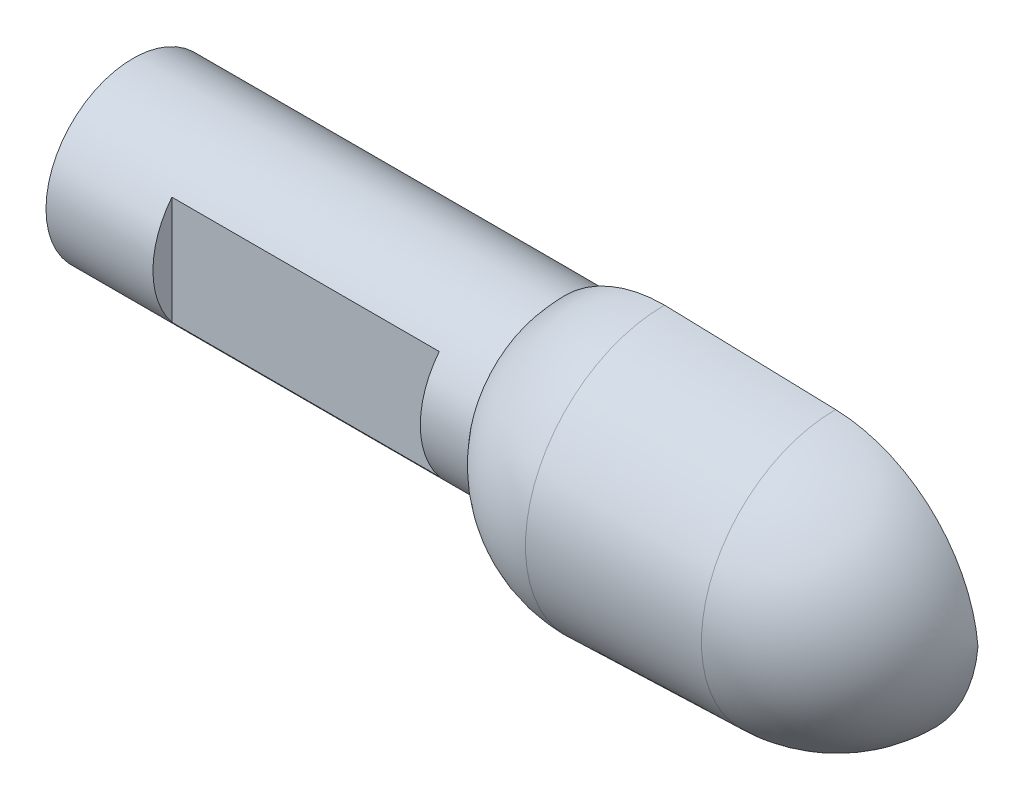
ISO-10303-21;
HEADER;
FILE_DESCRIPTION(('STEP AP214'),'2;1');
FILE_NAME('part.step','',(''),(''),'','','');
FILE_SCHEMA(('AUTOMOTIVE_DESIGN { 1 0 10303 214 1 1 1 1 }'));
ENDSEC;
DATA;
#1=APPLICATION_CONTEXT('core data for automotive mechanical design processes');
#2=APPLICATION_PROTOCOL_DEFINITION('international standard','automotive_design',2000,#1);
#3=PRODUCT_CONTEXT('',#1,'mechanical');
#4=PRODUCT('Part','Part','',(#3));
#5=PRODUCT_RELATED_PRODUCT_CATEGORY('part','',(#4));
#6=PRODUCT_DEFINITION_FORMATION('','',#4);
#7=PRODUCT_DEFINITION_CONTEXT('part definition',#1,'design');
#8=PRODUCT_DEFINITION('design','',#6,#7);
#9=PRODUCT_DEFINITION_SHAPE('','',#8);
#10=(LENGTH_UNIT() NAMED_UNIT(*) SI_UNIT(.MILLI.,.METRE.));
#11=(NAMED_UNIT(*) PLANE_ANGLE_UNIT() SI_UNIT($,.RADIAN.));
#12=(NAMED_UNIT(*) SI_UNIT($,.STERADIAN.) SOLID_ANGLE_UNIT());
#13=UNCERTAINTY_MEASURE_WITH_UNIT(LENGTH_MEASURE(1.E-05),#10,'distance_accuracy_value','');
#14=(GEOMETRIC_REPRESENTATION_CONTEXT(3) GLOBAL_UNCERTAINTY_ASSIGNED_CONTEXT((#13)) GLOBAL_UNIT_ASSIGNED_CONTEXT((#10,
#11,#12)) REPRESENTATION_CONTEXT('',''));
#15=CARTESIAN_POINT('',(0.,0.,0.));
#16=DIRECTION('',(0.,0.,1.));
#17=DIRECTION('',(1.,0.,0.));
#18=AXIS2_PLACEMENT_3D('',#15,#16,#17);
#19=CARTESIAN_POINT('',(-13.7943849702987,0.,0.));
#20=DIRECTION('',(-1.,0.,0.));
#21=DIRECTION('',(0.,0.,1.));
#22=AXIS2_PLACEMENT_3D('',#19,#20,#21);
#23=CYLINDRICAL_SURFACE('',#22,1.625);
#24=DIRECTION('',(1.,0.,0.));
#25=VECTOR('',#24,1.);
#26=CARTESIAN_POINT('',(-5.73150289017342,1.14456738278749,-1.15351224798828));
#27=LINE('',#26,#25);
#28=CARTESIAN_POINT('',(-5.73150289017342,1.14456738278749,-1.15351224798828));
#29=VERTEX_POINT('',#28);
#30=CARTESIAN_POINT('',(0.268497109826585,1.14456738278749,-1.15351224798828));
#31=VERTEX_POINT('',#30);
#32=EDGE_CURVE('E133',#29,#31,#27,.T.);
#33=ORIENTED_EDGE('',*,*,#32,.F.);
#34=CARTESIAN_POINT('',(-5.73150289017342,0.,2.59774840527527E-13));
#35=DIRECTION('',(1.,0.,0.));
#36=DIRECTION('',(0.,0.,1.));
#37=AXIS2_PLACEMENT_3D('',#34,#35,#36);
#38=CIRCLE('',#37,1.62500000000018);
#39=CARTESIAN_POINT('',(-5.73150289017342,-1.14456738278749,-1.15351224798828));
#40=VERTEX_POINT('',#39);
#41=EDGE_CURVE('E123',#40,#29,#38,.T.);
#42=ORIENTED_EDGE('',*,*,#41,.F.);
#43=DIRECTION('',(1.,0.,0.));
#44=VECTOR('',#43,1.);
#45=CARTESIAN_POINT('',(-5.73150289017342,-1.14456738278749,-1.15351224798828));
#46=LINE('',#45,#44);
#47=CARTESIAN_POINT('',(0.268497109826585,-1.14456738278749,-1.15351224798828));
#48=VERTEX_POINT('',#47);
#49=EDGE_CURVE('E135',#40,#48,#46,.T.);
#50=ORIENTED_EDGE('',*,*,#49,.T.);
#51=CARTESIAN_POINT('',(0.268497109826585,0.,2.59774840527527E-13));
#52=DIRECTION('',(1.,0.,0.));
#53=DIRECTION('',(0.,0.,1.));
#54=AXIS2_PLACEMENT_3D('',#51,#52,#53);
#55=CIRCLE('',#54,1.62500000000018);
#56=EDGE_CURVE('E138',#48,#31,#55,.T.);
#57=ORIENTED_EDGE('',*,*,#56,.T.);
#58=EDGE_LOOP('',(#33,#42,#50,#57));
#59=FACE_BOUND('',#58,.T.);
#60=DIRECTION('',(-1.,0.,0.));
#61=VECTOR('',#60,1.);
#62=CARTESIAN_POINT('',(0.368497109826584,1.01300672726204,1.27060708738848));
#63=LINE('',#62,#61);
#64=CARTESIAN_POINT('',(0.368497109826584,1.01300672726204,1.27060708738848));
#65=VERTEX_POINT('',#64);
#66=CARTESIAN_POINT('',(-4.63150289017342,1.01300672726204,1.27060708738848));
#67=VERTEX_POINT('',#66);
#68=EDGE_CURVE('E149',#65,#67,#63,.T.);
#69=ORIENTED_EDGE('',*,*,#68,.F.);
#70=CARTESIAN_POINT('',(0.368497109826584,0.,-2.29850860566927E-12));
#71=DIRECTION('',(-1.,0.,0.));
#72=DIRECTION('',(0.,0.,-1.));
#73=AXIS2_PLACEMENT_3D('',#70,#71,#72);
#74=CIRCLE('',#73,1.6250000000018);
#75=CARTESIAN_POINT('',(0.368497109826584,-1.01300672726204,1.27060708738848));
#76=VERTEX_POINT('',#75);
#77=EDGE_CURVE('E144',#76,#65,#74,.T.);
#78=ORIENTED_EDGE('',*,*,#77,.F.);
#79=DIRECTION('',(-1.,0.,0.));
#80=VECTOR('',#79,1.);
#81=CARTESIAN_POINT('',(0.368497109826584,-1.01300672726204,1.27060708738848));
#82=LINE('',#81,#80);
#83=CARTESIAN_POINT('',(-4.63150289017342,-1.01300672726204,1.27060708738848));
#84=VERTEX_POINT('',#83);
#85=EDGE_CURVE('E153',#76,#84,#82,.T.);
#86=ORIENTED_EDGE('',*,*,#85,.T.);
#87=CARTESIAN_POINT('',(-4.63150289017342,0.,-2.29850860566927E-12));
#88=DIRECTION('',(-1.,0.,0.));
#89=DIRECTION('',(0.,0.,-1.));
#90=AXIS2_PLACEMENT_3D('',#87,#88,#89);
#91=CIRCLE('',#90,1.6250000000018);
#92=EDGE_CURVE('E140',#84,#67,#91,.T.);
#93=ORIENTED_EDGE('',*,*,#92,.T.);
#94=EDGE_LOOP('',(#69,#78,#86,#93));
#95=FACE_BOUND('',#94,.T.);
#96=CARTESIAN_POINT('',(-6.63150289017342,0.,0.));
#97=DIRECTION('',(-1.,0.,0.));
#98=DIRECTION('',(0.,0.,1.));
#99=AXIS2_PLACEMENT_3D('',#96,#97,#98);
#100=CIRCLE('',#99,1.625);
#101=CARTESIAN_POINT('',(-6.63150289017342,0.,1.625));
#102=VERTEX_POINT('',#101);
#103=EDGE_CURVE('E252',#102,#102,#100,.T.);
#104=ORIENTED_EDGE('',*,*,#103,.F.);
#105=EDGE_LOOP('',(#104));
#106=FACE_BOUND('',#105,.T.);
#107=CARTESIAN_POINT('',(1.26849710982659,0.,0.));
#108=DIRECTION('',(1.,0.,0.));
#109=DIRECTION('',(0.,0.,-1.));
#110=AXIS2_PLACEMENT_3D('',#107,#108,#109);
#111=CIRCLE('',#110,1.625);
#112=CARTESIAN_POINT('',(1.26849710982658,-1.625,0.));
#113=VERTEX_POINT('',#112);
#114=CARTESIAN_POINT('',(1.26849710982658,1.625,0.));
#115=VERTEX_POINT('',#114);
#116=EDGE_CURVE('E229',#113,#115,#111,.T.);
#117=ORIENTED_EDGE('',*,*,#116,.F.);
#118=CARTESIAN_POINT('',(1.26849710982659,0.,0.));
#119=DIRECTION('',(-1.,0.,0.));
#120=DIRECTION('',(0.,0.,1.));
#121=AXIS2_PLACEMENT_3D('',#118,#119,#120);
#122=CIRCLE('',#121,1.625);
#123=EDGE_CURVE('E249',#113,#115,#122,.T.);
#124=ORIENTED_EDGE('',*,*,#123,.T.);
#125=EDGE_LOOP('',(#117,#124));
#126=FACE_BOUND('',#125,.T.);
#127=ADVANCED_FACE('F38',(#59,#95,#106,#126),#23,.T.);
#128=CARTESIAN_POINT('',(6.43158579270918,0.,-0.242385595637127));
#129=DIRECTION('',(0.,-1.,0.));
#130=DIRECTION('',(0.,0.,1.));
#131=AXIS2_PLACEMENT_3D('',#128,#129,#130);
#132=CIRCLE('',#131,2.75218391789528);
#133=TRIMMED_CURVE('',#132,(PARAMETER_VALUE(-1.48261180116489)),
(PARAMETER_VALUE(1.48261180116489)),.T.,.PARAMETER.);
#134=CARTESIAN_POINT('',(6.43158579270918,0.,0.));
#135=DIRECTION('',(-1.,0.,0.));
#136=AXIS1_PLACEMENT('',#134,#135);
#137=SURFACE_OF_REVOLUTION('',#133,#136);
#138=CARTESIAN_POINT('',(6.43158579270918,0.242385595637127,0.));
#139=DIRECTION('',(0.,0.,1.));
#140=DIRECTION('',(1.,0.,0.));
#141=AXIS2_PLACEMENT_3D('',#138,#139,#140);
#142=CIRCLE('',#141,2.75218391789528);
#143=CARTESIAN_POINT('',(6.51009574814901,-2.50867829035648,0.));
#144=VERTEX_POINT('',#143);
#145=CARTESIAN_POINT('',(9.17307544998477,0.,0.));
#146=VERTEX_POINT('',#145);
#147=EDGE_CURVE('E11',#144,#146,#142,.T.);
#148=ORIENTED_EDGE('',*,*,#147,.T.);
#149=CARTESIAN_POINT('',(6.43158579270918,-0.242385595637127,0.));
#150=DIRECTION('',(0.,0.,1.));
#151=DIRECTION('',(1.,0.,0.));
#152=AXIS2_PLACEMENT_3D('',#149,#150,#151);
#153=CIRCLE('',#152,2.75218391789528);
#154=CARTESIAN_POINT('',(6.51009574814901,2.50867829035648,0.));
#155=VERTEX_POINT('',#154);
#156=EDGE_CURVE('E46',#146,#155,#153,.T.);
#157=ORIENTED_EDGE('',*,*,#156,.T.);
#158=CARTESIAN_POINT('',(6.51009574814901,0.,0.));
#159=DIRECTION('',(-1.,0.,0.));
#160=DIRECTION('',(0.,0.,1.));
#161=AXIS2_PLACEMENT_3D('',#158,#159,#160);
#162=CIRCLE('',#161,2.50867829035648);
#163=EDGE_CURVE('E243',#144,#155,#162,.T.);
#164=ORIENTED_EDGE('',*,*,#163,.F.);
#165=EDGE_LOOP('',(#148,#157,#164));
#166=FACE_BOUND('',#165,.T.);
#167=ADVANCED_FACE('F258',(#166),#137,.T.);
#168=CARTESIAN_POINT('',(-6.63150289017342,0.,0.));
#169=DIRECTION('',(1.,0.,0.));
#170=DIRECTION('',(0.,0.,-1.));
#171=AXIS2_PLACEMENT_3D('',#168,#169,#170);
#172=PLANE('',#171);
#173=ORIENTED_EDGE('',*,*,#103,.T.);
#174=EDGE_LOOP('',(#173));
#175=FACE_BOUND('',#174,.T.);
#176=ADVANCED_FACE('F40',(#175),#172,.F.);
#177=CARTESIAN_POINT('',(3.31009574814917,0.,0.));
#178=DIRECTION('',(-1.,0.,0.));
#179=DIRECTION('',(0.,0.,1.));
#180=AXIS2_PLACEMENT_3D('',#177,#178,#179);
#181=DEGENERATE_TOROIDAL_SURFACE('',#180,0.0250000000003338,2.62500000000033,.F.);
#182=ORIENTED_EDGE('',*,*,#123,.F.);
#183=CARTESIAN_POINT('',(3.31009574814917,0.0250000000003338,0.));
#184=DIRECTION('',(0.,0.,1.));
#185=DIRECTION('',(1.,0.,0.));
#186=AXIS2_PLACEMENT_3D('',#183,#184,#185);
#187=CIRCLE('',#186,2.62500000000033);
#188=CARTESIAN_POINT('',(3.31009574814902,-2.6,0.));
#189=VERTEX_POINT('',#188);
#190=EDGE_CURVE('E240',#113,#189,#187,.T.);
#191=ORIENTED_EDGE('',*,*,#190,.T.);
#192=CARTESIAN_POINT('',(3.31009574814902,0.,0.));
#193=DIRECTION('',(-1.,0.,0.));
#194=DIRECTION('',(0.,0.,1.));
#195=AXIS2_PLACEMENT_3D('',#192,#193,#194);
#196=CIRCLE('',#195,2.6);
#197=CARTESIAN_POINT('',(3.31009574817045,2.59999999999969,0.));
#198=VERTEX_POINT('',#197);
#199=EDGE_CURVE('E246',#189,#198,#196,.T.);
#200=ORIENTED_EDGE('',*,*,#199,.T.);
#201=CARTESIAN_POINT('',(3.31009574814917,-0.0250000000003338,0.));
#202=DIRECTION('',(0.,0.,1.));
#203=DIRECTION('',(1.,0.,0.));
#204=AXIS2_PLACEMENT_3D('',#201,#202,#203);
#205=CIRCLE('',#204,2.62500000000033);
#206=EDGE_CURVE('E234',#198,#115,#205,.T.);
#207=ORIENTED_EDGE('',*,*,#206,.T.);
#208=EDGE_LOOP('',(#182,#191,#200,#207));
#209=FACE_BOUND('',#208,.T.);
#210=ADVANCED_FACE('F267',(#209),#181,.F.);
#211=CARTESIAN_POINT('',(6.51009574814901,0.,0.));
#212=DIRECTION('',(-1.,0.,0.));
#213=DIRECTION('',(0.,0.,1.));
#214=AXIS2_PLACEMENT_3D('',#211,#212,#213);
#215=CONICAL_SURFACE('',#214,2.50867829035648,0.0285302907375562);
#216=ORIENTED_EDGE('',*,*,#199,.F.);
#217=DIRECTION('',(0.999593038861106,0.0285264203926731,0.));
#218=VECTOR('',#217,1.);
#219=CARTESIAN_POINT('',(94.4165810787237,0.,0.));
#220=LINE('',#219,#218);
#221=EDGE_CURVE('E237',#189,#144,#220,.T.);
#222=ORIENTED_EDGE('',*,*,#221,.T.);
#223=ORIENTED_EDGE('',*,*,#163,.T.);
#224=DIRECTION('',(-0.999593038861106,0.0285264203926731,0.));
#225=VECTOR('',#224,1.);
#226=CARTESIAN_POINT('',(94.4165810787237,0.,0.));
#227=LINE('',#226,#225);
#228=EDGE_CURVE('E231',#155,#198,#227,.T.);
#229=ORIENTED_EDGE('',*,*,#228,.T.);
#230=EDGE_LOOP('',(#216,#222,#223,#229));
#231=FACE_BOUND('',#230,.T.);
#232=ADVANCED_FACE('F262',(#231),#215,.T.);
#233=CARTESIAN_POINT('',(9.17307544998477,-1.625,0.));
#234=DIRECTION('',(0.,0.,1.));
#235=DIRECTION('',(1.,0.,0.));
#236=AXIS2_PLACEMENT_3D('',#233,#234,#235);
#237=PLANE('',#236);
#238=DIRECTION('',(-1.,0.,0.));
#239=VECTOR('',#238,1.);
#240=CARTESIAN_POINT('',(6.7546160430892,-1.96286599297792,0.));
#241=LINE('',#240,#239);
#242=CARTESIAN_POINT('',(6.7546160430892,-1.96286599297792,0.));
#243=VERTEX_POINT('',#242);
#244=CARTESIAN_POINT('',(2.94362361413417,-1.96286599297792,0.));
#245=VERTEX_POINT('',#244);
#246=EDGE_CURVE('E159',#243,#245,#241,.T.);
#247=ORIENTED_EDGE('',*,*,#246,.F.);
#248=CARTESIAN_POINT('',(6.42445041489691,0.,0.));
#249=DIRECTION('',(0.,0.,-1.));
#250=DIRECTION('',(-1.,0.,0.));
#251=AXIS2_PLACEMENT_3D('',#248,#249,#250);
#252=CIRCLE('',#251,1.99044021473362);
#253=CARTESIAN_POINT('',(6.7546160430892,1.96286599297792,0.));
#254=VERTEX_POINT('',#253);
#255=EDGE_CURVE('E156',#254,#243,#252,.T.);
#256=ORIENTED_EDGE('',*,*,#255,.F.);
#257=DIRECTION('',(1.,0.,0.));
#258=VECTOR('',#257,1.);
#259=CARTESIAN_POINT('',(6.7546160430892,1.96286599297792,0.));
#260=LINE('',#259,#258);
#261=CARTESIAN_POINT('',(2.94362361413417,1.96286599297792,0.));
#262=VERTEX_POINT('',#261);
#263=EDGE_CURVE('E165',#262,#254,#260,.T.);
#264=ORIENTED_EDGE('',*,*,#263,.F.);
#265=CARTESIAN_POINT('',(4.26503724646551,0.,0.));
#266=DIRECTION('',(0.,0.,-1.));
#267=DIRECTION('',(-1.,0.,0.));
#268=AXIS2_PLACEMENT_3D('',#265,#266,#267);
#269=CIRCLE('',#268,2.36621573278945);
#270=EDGE_CURVE('E162',#245,#262,#269,.T.);
#271=ORIENTED_EDGE('',*,*,#270,.F.);
#272=EDGE_LOOP('',(#247,#256,#264,#271));
#273=FACE_BOUND('',#272,.T.);
#274=ORIENTED_EDGE('',*,*,#156,.F.);
#275=ORIENTED_EDGE('',*,*,#147,.F.);
#276=ORIENTED_EDGE('',*,*,#221,.F.);
#277=ORIENTED_EDGE('',*,*,#190,.F.);
#278=DIRECTION('',(0.,1.,0.));
#279=VECTOR('',#278,1.);
#280=CARTESIAN_POINT('',(1.26849710982658,1.625,0.));
#281=LINE('',#280,#279);
#282=EDGE_CURVE('E177',#113,#115,#281,.T.);
#283=ORIENTED_EDGE('',*,*,#282,.T.);
#284=ORIENTED_EDGE('',*,*,#206,.F.);
#285=ORIENTED_EDGE('',*,*,#228,.F.);
#286=EDGE_LOOP('',(#274,#275,#276,#277,#283,#284,#285));
#287=FACE_BOUND('',#286,.T.);
#288=ADVANCED_FACE('F264',(#273,#287),#237,.F.);
#289=CARTESIAN_POINT('',(1.26849710982658,1.625,-1.625));
#290=DIRECTION('',(1.,0.,0.));
#291=DIRECTION('',(0.,0.,-1.));
#292=AXIS2_PLACEMENT_3D('',#289,#290,#291);
#293=PLANE('',#292);
#294=ORIENTED_EDGE('',*,*,#116,.T.);
#295=ORIENTED_EDGE('',*,*,#282,.F.);
#296=EDGE_LOOP('',(#294,#295));
#297=FACE_BOUND('',#296,.T.);
#298=ADVANCED_FACE('F192',(#297),#293,.T.);
#299=CARTESIAN_POINT('',(6.42445041489691,0.,0.));
#300=DIRECTION('',(0.,0.,-1.));
#301=DIRECTION('',(-1.,0.,0.));
#302=AXIS2_PLACEMENT_3D('',#299,#300,#301);
#303=CONICAL_SURFACE('',#302,1.99044021473362,0.436332312998583);
#304=ORIENTED_EDGE('',*,*,#255,.T.);
#305=CARTESIAN_POINT('',(6.71305602900537,-1.49655833482292,1.));
#306=CARTESIAN_POINT('',(6.7204467516302,-1.57426890732032,0.833349139482575));
#307=CARTESIAN_POINT('',(6.72760544813327,-1.65198317330437,0.666690358257445));
#308=CARTESIAN_POINT('',(6.74145878596485,-1.80741905935917,0.333357024917408));
#309=CARTESIAN_POINT('',(6.74815342748972,-1.88514067942678,0.166682472809205));
#310=CARTESIAN_POINT('',(6.7546160430892,-1.96286599297792,0.));
#311=B_SPLINE_CURVE_WITH_KNOTS('',3,(#305,#306,#307,#308,#309,#310),.UNSPECIFIED.,.F.,.F.,(4,2,
4),(0.,0.552080728600977,1.10416122358695),.UNSPECIFIED.);
#312=CARTESIAN_POINT('',(6.71305602900537,-1.49655833482292,1.));
#313=VERTEX_POINT('',#312);
#314=EDGE_CURVE('E179',#313,#243,#311,.T.);
#315=ORIENTED_EDGE('',*,*,#314,.F.);
#316=CARTESIAN_POINT('',(6.42445041489691,0.,1.));
#317=DIRECTION('',(0.,0.,-1.));
#318=DIRECTION('',(-1.,0.,0.));
#319=AXIS2_PLACEMENT_3D('',#316,#317,#318);
#320=CIRCLE('',#319,1.52413255657862);
#321=CARTESIAN_POINT('',(6.71305602900537,1.49655833482292,1.));
#322=VERTEX_POINT('',#321);
#323=EDGE_CURVE('E168',#322,#313,#320,.T.);
#324=ORIENTED_EDGE('',*,*,#323,.F.);
#325=CARTESIAN_POINT('',(6.71305602900537,1.49655833482292,1.));
#326=CARTESIAN_POINT('',(6.7204467516302,1.57426890732032,0.833349139482575));
#327=CARTESIAN_POINT('',(6.72760544813327,1.65198317330437,0.666690358257445));
#328=CARTESIAN_POINT('',(6.74145878596485,1.80741905935917,0.333357024917408));
#329=CARTESIAN_POINT('',(6.74815342748972,1.88514067942678,0.166682472809205));
#330=CARTESIAN_POINT('',(6.7546160430892,1.96286599297792,0.));
#331=B_SPLINE_CURVE_WITH_KNOTS('',3,(#325,#326,#327,#328,#329,#330),.UNSPECIFIED.,.F.,.F.,(4,2,
4),(0.,0.552080728600977,1.10416122358695),.UNSPECIFIED.);
#332=EDGE_CURVE('E169',#322,#254,#331,.T.);
#333=ORIENTED_EDGE('',*,*,#332,.T.);
#334=EDGE_LOOP('',(#304,#315,#324,#333));
#335=FACE_BOUND('',#334,.T.);
#336=ADVANCED_FACE('F189',(#335),#303,.F.);
#337=CARTESIAN_POINT('',(6.7546160430892,1.96286599297792,0.));
#338=DIRECTION('',(0.,0.906307787036649,0.4226182617407));
#339=DIRECTION('',(0.,-0.4226182617407,0.90630778703665));
#340=AXIS2_PLACEMENT_3D('',#337,#338,#339);
#341=PLANE('',#340);
#342=ORIENTED_EDGE('',*,*,#263,.T.);
#343=ORIENTED_EDGE('',*,*,#332,.F.);
#344=DIRECTION('',(1.,0.,0.));
#345=VECTOR('',#344,1.);
#346=CARTESIAN_POINT('',(6.42445041489691,1.49655833482292,1.));
#347=LINE('',#346,#345);
#348=CARTESIAN_POINT('',(3.09458270119977,1.49655833482292,1.));
#349=VERTEX_POINT('',#348);
#350=EDGE_CURVE('E219',#349,#322,#347,.T.);
#351=ORIENTED_EDGE('',*,*,#350,.F.);
#352=CARTESIAN_POINT('',(3.09458270119977,1.49655833482292,1.));
#353=CARTESIAN_POINT('',(3.08120861707617,1.53537080973648,0.916766378945777));
#354=CARTESIAN_POINT('',(3.06805694738917,1.57419689562582,0.833503569059787));
#355=CARTESIAN_POINT('',(3.04216188046936,1.65187273337092,0.666927197459032));
#356=CARTESIAN_POINT('',(3.02941847648429,1.69072248482445,0.583613636606877));
#357=CARTESIAN_POINT('',(3.00430299899854,1.76844321334852,0.416940996419962));
#358=CARTESIAN_POINT('',(2.99193092388273,1.807314190326,0.333581917284792));
#359=CARTESIAN_POINT('',(2.96752837591132,1.88507595278688,0.1668212795364));
#360=CARTESIAN_POINT('',(2.9554979087079,1.92396673858722,0.0834197202435245));
#361=CARTESIAN_POINT('',(2.94362361413417,1.96286599297792,0.));
#362=B_SPLINE_CURVE_WITH_KNOTS('',3,(#352,#353,#354,#355,#356,#357,#358,#359,#360,#361),
.UNSPECIFIED.,.F.,.F.,(4,2,2,2,4),(0.,0.278419993996668,0.556835380858735,0.835249556561253,
1.11366833617555),.UNSPECIFIED.);
#363=EDGE_CURVE('E178',#349,#262,#362,.T.);
#364=ORIENTED_EDGE('',*,*,#363,.T.);
#365=EDGE_LOOP('',(#342,#343,#351,#364));
#366=FACE_BOUND('',#365,.T.);
#367=ADVANCED_FACE('F186',(#366),#341,.F.);
#368=CARTESIAN_POINT('',(4.26503724646551,0.,0.));
#369=DIRECTION('',(0.,0.,-1.));
#370=DIRECTION('',(-1.,0.,0.));
#371=AXIS2_PLACEMENT_3D('',#368,#369,#370);
#372=CONICAL_SURFACE('',#371,2.36621573278945,0.436332312998583);
#373=ORIENTED_EDGE('',*,*,#270,.T.);
#374=ORIENTED_EDGE('',*,*,#363,.F.);
#375=CARTESIAN_POINT('',(4.26503724646551,0.,1.));
#376=DIRECTION('',(0.,0.,-1.));
#377=DIRECTION('',(-1.,0.,0.));
#378=AXIS2_PLACEMENT_3D('',#375,#376,#377);
#379=CIRCLE('',#378,1.89990807463445);
#380=CARTESIAN_POINT('',(3.09458270119977,-1.49655833482292,1.));
#381=VERTEX_POINT('',#380);
#382=EDGE_CURVE('E222',#381,#349,#379,.T.);
#383=ORIENTED_EDGE('',*,*,#382,.F.);
#384=CARTESIAN_POINT('',(3.09458270119977,-1.49655833482292,1.));
#385=CARTESIAN_POINT('',(3.08120861707617,-1.53537080973648,0.916766378945777));
#386=CARTESIAN_POINT('',(3.06805694738917,-1.57419689562582,0.833503569059787));
#387=CARTESIAN_POINT('',(3.04216188046936,-1.65187273337092,0.666927197459032));
#388=CARTESIAN_POINT('',(3.02941847648429,-1.69072248482445,0.583613636606877));
#389=CARTESIAN_POINT('',(3.00430299899854,-1.76844321334852,0.416940996419962));
#390=CARTESIAN_POINT('',(2.99193092388273,-1.807314190326,0.333581917284792));
#391=CARTESIAN_POINT('',(2.96752837591132,-1.88507595278688,0.1668212795364));
#392=CARTESIAN_POINT('',(2.9554979087079,-1.92396673858722,0.0834197202435245));
#393=CARTESIAN_POINT('',(2.94362361413417,-1.96286599297792,0.));
#394=B_SPLINE_CURVE_WITH_KNOTS('',3,(#384,#385,#386,#387,#388,#389,#390,#391,#392,#393),
.UNSPECIFIED.,.F.,.F.,(4,2,2,2,4),(0.,0.278419993996668,0.556835380858735,0.835249556561252,
1.11366833617555),.UNSPECIFIED.);
#395=EDGE_CURVE('E205',#381,#245,#394,.T.);
#396=ORIENTED_EDGE('',*,*,#395,.T.);
#397=EDGE_LOOP('',(#373,#374,#383,#396));
#398=FACE_BOUND('',#397,.T.);
#399=ADVANCED_FACE('F200',(#398),#372,.F.);
#400=CARTESIAN_POINT('',(6.7546160430892,-1.96286599297792,0.));
#401=DIRECTION('',(0.,-0.906307787036649,0.4226182617407));
#402=DIRECTION('',(0.,-0.4226182617407,-0.90630778703665));
#403=AXIS2_PLACEMENT_3D('',#400,#401,#402);
#404=PLANE('',#403);
#405=ORIENTED_EDGE('',*,*,#246,.T.);
#406=ORIENTED_EDGE('',*,*,#395,.F.);
#407=DIRECTION('',(-1.,0.,0.));
#408=VECTOR('',#407,1.);
#409=CARTESIAN_POINT('',(6.42445041489691,-1.49655833482292,1.));
#410=LINE('',#409,#408);
#411=EDGE_CURVE('E218',#313,#381,#410,.T.);
#412=ORIENTED_EDGE('',*,*,#411,.F.);
#413=ORIENTED_EDGE('',*,*,#314,.T.);
#414=EDGE_LOOP('',(#405,#406,#412,#413));
#415=FACE_BOUND('',#414,.T.);
#416=ADVANCED_FACE('F194',(#415),#404,.F.);
#417=CARTESIAN_POINT('',(6.42445041489691,0.,1.));
#418=DIRECTION('',(0.,0.,-1.));
#419=DIRECTION('',(-1.,0.,0.));
#420=AXIS2_PLACEMENT_3D('',#417,#418,#419);
#421=PLANE('',#420);
#422=ORIENTED_EDGE('',*,*,#323,.T.);
#423=ORIENTED_EDGE('',*,*,#411,.T.);
#424=ORIENTED_EDGE('',*,*,#382,.T.);
#425=ORIENTED_EDGE('',*,*,#350,.T.);
#426=EDGE_LOOP('',(#422,#423,#424,#425));
#427=FACE_BOUND('',#426,.T.);
#428=ADVANCED_FACE('F199',(#427),#421,.T.);
#429=CARTESIAN_POINT('',(0.368497109826584,-1.01300672726204,1.27060708738848));
#430=DIRECTION('',(0.,0.,-1.));
#431=DIRECTION('',(-1.,0.,0.));
#432=AXIS2_PLACEMENT_3D('',#429,#430,#431);
#433=PLANE('',#432);
#434=DIRECTION('',(0.,-1.,0.));
#435=VECTOR('',#434,1.);
#436=CARTESIAN_POINT('',(-4.63150289017342,-1.01300672726204,1.27060708738848));
#437=LINE('',#436,#435);
#438=EDGE_CURVE('E59',#67,#84,#437,.T.);
#439=ORIENTED_EDGE('',*,*,#438,.T.);
#440=ORIENTED_EDGE('',*,*,#85,.F.);
#441=DIRECTION('',(0.,-1.,0.));
#442=VECTOR('',#441,1.);
#443=CARTESIAN_POINT('',(0.368497109826584,-1.01300672726204,1.27060708738848));
#444=LINE('',#443,#442);
#445=EDGE_CURVE('E146',#65,#76,#444,.T.);
#446=ORIENTED_EDGE('',*,*,#445,.F.);
#447=ORIENTED_EDGE('',*,*,#68,.T.);
#448=EDGE_LOOP('',(#439,#440,#446,#447));
#449=FACE_BOUND('',#448,.T.);
#450=ADVANCED_FACE('F365',(#449),#433,.F.);
#451=CARTESIAN_POINT('',(0.368497109826584,0.,-2.29850860566927E-12));
#452=DIRECTION('',(1.,0.,0.));
#453=DIRECTION('',(0.,0.,-1.));
#454=AXIS2_PLACEMENT_3D('',#451,#452,#453);
#455=PLANE('',#454);
#456=ORIENTED_EDGE('',*,*,#77,.T.);
#457=ORIENTED_EDGE('',*,*,#445,.T.);
#458=EDGE_LOOP('',(#456,#457));
#459=FACE_BOUND('',#458,.T.);
#460=ADVANCED_FACE('F373',(#459),#455,.F.);
#461=CARTESIAN_POINT('',(-4.63150289017342,0.,-2.29850860566927E-12));
#462=DIRECTION('',(1.,0.,0.));
#463=DIRECTION('',(0.,0.,-1.));
#464=AXIS2_PLACEMENT_3D('',#461,#462,#463);
#465=PLANE('',#464);
#466=ORIENTED_EDGE('',*,*,#92,.F.);
#467=ORIENTED_EDGE('',*,*,#438,.F.);
#468=EDGE_LOOP('',(#466,#467));
#469=FACE_BOUND('',#468,.T.);
#470=ADVANCED_FACE('F382',(#469),#465,.T.);
#471=CARTESIAN_POINT('',(-5.73150289017342,1.14456738278749,-1.15351224798828));
#472=DIRECTION('',(0.,0.,1.));
#473=DIRECTION('',(1.,0.,0.));
#474=AXIS2_PLACEMENT_3D('',#471,#472,#473);
#475=PLANE('',#474);
#476=DIRECTION('',(0.,-1.,0.));
#477=VECTOR('',#476,1.);
#478=CARTESIAN_POINT('',(0.268497109826585,1.14456738278749,-1.15351224798828));
#479=LINE('',#478,#477);
#480=EDGE_CURVE('E52',#31,#48,#479,.T.);
#481=ORIENTED_EDGE('',*,*,#480,.T.);
#482=ORIENTED_EDGE('',*,*,#49,.F.);
#483=DIRECTION('',(0.,-1.,0.));
#484=VECTOR('',#483,1.);
#485=CARTESIAN_POINT('',(-5.73150289017342,1.14456738278749,-1.15351224798828));
#486=LINE('',#485,#484);
#487=EDGE_CURVE('E126',#29,#40,#486,.T.);
#488=ORIENTED_EDGE('',*,*,#487,.F.);
#489=ORIENTED_EDGE('',*,*,#32,.T.);
#490=EDGE_LOOP('',(#481,#482,#488,#489));
#491=FACE_BOUND('',#490,.T.);
#492=ADVANCED_FACE('F132',(#491),#475,.F.);
#493=CARTESIAN_POINT('',(-5.73150289017342,0.,2.59774840527527E-13));
#494=DIRECTION('',(-1.,0.,0.));
#495=DIRECTION('',(0.,0.,1.));
#496=AXIS2_PLACEMENT_3D('',#493,#494,#495);
#497=PLANE('',#496);
#498=ORIENTED_EDGE('',*,*,#41,.T.);
#499=ORIENTED_EDGE('',*,*,#487,.T.);
#500=EDGE_LOOP('',(#498,#499));
#501=FACE_BOUND('',#500,.T.);
#502=ADVANCED_FACE('F125',(#501),#497,.F.);
#503=CARTESIAN_POINT('',(0.268497109826585,0.,2.59774840527527E-13));
#504=DIRECTION('',(-1.,0.,0.));
#505=DIRECTION('',(0.,0.,1.));
#506=AXIS2_PLACEMENT_3D('',#503,#504,#505);
#507=PLANE('',#506);
#508=ORIENTED_EDGE('',*,*,#56,.F.);
#509=ORIENTED_EDGE('',*,*,#480,.F.);
#510=EDGE_LOOP('',(#508,#509));
#511=FACE_BOUND('',#510,.T.);
#512=ADVANCED_FACE('F403',(#511),#507,.T.);
#513=CLOSED_SHELL('',(#127,#167,#176,#210,#232,#288,#298,#336,#367,#399,#416,#428,#450,#460,
#470,#492,#502,#512));
#514=MANIFOLD_SOLID_BREP('B2',#513);
#515=ADVANCED_BREP_SHAPE_REPRESENTATION('',(#18,#514),#14);
#516=SHAPE_DEFINITION_REPRESENTATION(#9,#515);
ENDSEC;
END-ISO-10303-21;
